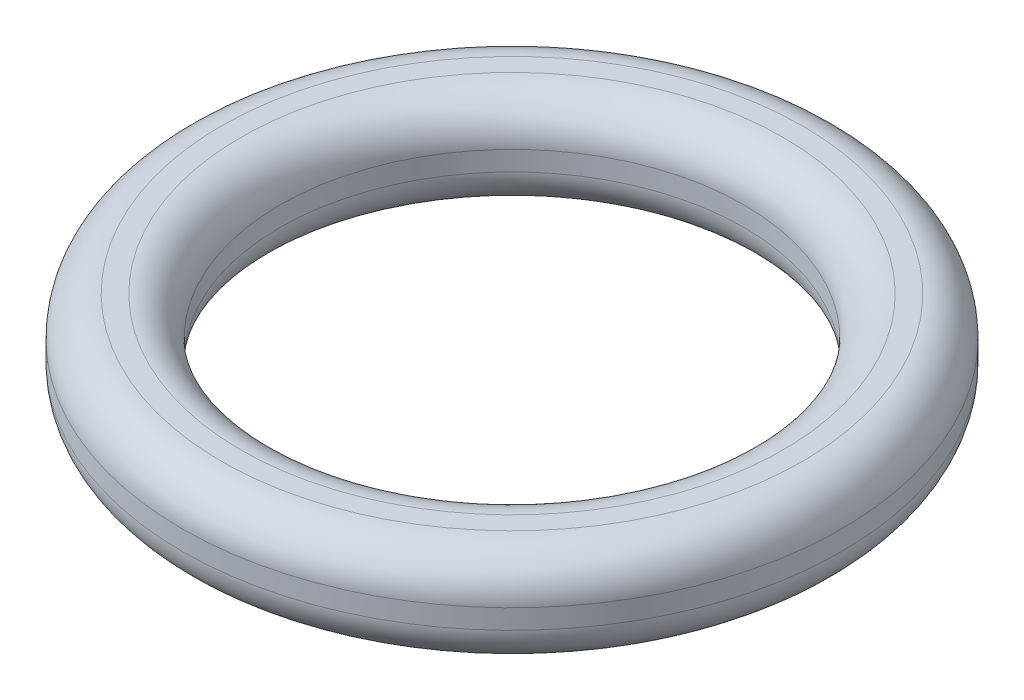
ISO-10303-21;
HEADER;
FILE_DESCRIPTION(('STEP AP214'),'2;1');
FILE_NAME('part.step','',(''),(''),'','','');
FILE_SCHEMA(('AUTOMOTIVE_DESIGN { 1 0 10303 214 1 1 1 1 }'));
ENDSEC;
DATA;
#1=APPLICATION_CONTEXT('core data for automotive mechanical design processes');
#2=APPLICATION_PROTOCOL_DEFINITION('international standard','automotive_design',2000,#1);
#3=PRODUCT_CONTEXT('',#1,'mechanical');
#4=PRODUCT('Part','Part','',(#3));
#5=PRODUCT_RELATED_PRODUCT_CATEGORY('part','',(#4));
#6=PRODUCT_DEFINITION_FORMATION('','',#4);
#7=PRODUCT_DEFINITION_CONTEXT('part definition',#1,'design');
#8=PRODUCT_DEFINITION('design','',#6,#7);
#9=PRODUCT_DEFINITION_SHAPE('','',#8);
#10=(LENGTH_UNIT() NAMED_UNIT(*) SI_UNIT(.MILLI.,.METRE.));
#11=(NAMED_UNIT(*) PLANE_ANGLE_UNIT() SI_UNIT($,.RADIAN.));
#12=(NAMED_UNIT(*) SI_UNIT($,.STERADIAN.) SOLID_ANGLE_UNIT());
#13=UNCERTAINTY_MEASURE_WITH_UNIT(LENGTH_MEASURE(1.E-05),#10,'distance_accuracy_value','');
#14=(GEOMETRIC_REPRESENTATION_CONTEXT(3) GLOBAL_UNCERTAINTY_ASSIGNED_CONTEXT((#13)) GLOBAL_UNIT_ASSIGNED_CONTEXT((#10,
#11,#12)) REPRESENTATION_CONTEXT('',''));
#15=CARTESIAN_POINT('',(0.,0.,0.));
#16=DIRECTION('',(0.,0.,1.));
#17=DIRECTION('',(1.,0.,0.));
#18=AXIS2_PLACEMENT_3D('',#15,#16,#17);
#19=CARTESIAN_POINT('',(0.,0.8,0.));
#20=DIRECTION('',(0.,-1.,0.));
#21=DIRECTION('',(0.,0.,-1.));
#22=AXIS2_PLACEMENT_3D('',#19,#20,#21);
#23=TOROIDAL_SURFACE('',#22,5.95,0.8);
#24=CARTESIAN_POINT('',(0.,0.,0.));
#25=DIRECTION('',(0.,-1.,0.));
#26=DIRECTION('',(0.,0.,-1.));
#27=AXIS2_PLACEMENT_3D('',#24,#25,#26);
#28=CIRCLE('',#27,5.95);
#29=CARTESIAN_POINT('',(0.,0.,-5.95));
#30=VERTEX_POINT('',#29);
#31=EDGE_CURVE('E10',#30,#30,#28,.T.);
#32=ORIENTED_EDGE('',*,*,#31,.F.);
#33=EDGE_LOOP('',(#32));
#34=FACE_BOUND('',#33,.T.);
#35=CARTESIAN_POINT('',(0.,0.8,0.));
#36=DIRECTION('',(0.,-1.,0.));
#37=DIRECTION('',(0.,0.,-1.));
#38=AXIS2_PLACEMENT_3D('',#35,#36,#37);
#39=CIRCLE('',#38,6.75);
#40=CARTESIAN_POINT('',(0.,0.8,-6.75));
#41=VERTEX_POINT('',#40);
#42=EDGE_CURVE('E56',#41,#41,#39,.T.);
#43=ORIENTED_EDGE('',*,*,#42,.T.);
#44=EDGE_LOOP('',(#43));
#45=FACE_BOUND('',#44,.T.);
#46=ADVANCED_FACE('F28',(#34,#45),#23,.T.);
#47=CARTESIAN_POINT('',(-5.95,0.,0.));
#48=DIRECTION('',(0.,1.,0.));
#49=DIRECTION('',(0.,0.,1.));
#50=AXIS2_PLACEMENT_3D('',#47,#48,#49);
#51=PLANE('',#50);
#52=CARTESIAN_POINT('',(0.,0.,0.));
#53=DIRECTION('',(0.,-1.,0.));
#54=DIRECTION('',(0.,0.,-1.));
#55=AXIS2_PLACEMENT_3D('',#52,#53,#54);
#56=CIRCLE('',#55,5.55);
#57=CARTESIAN_POINT('',(0.,0.,-5.55));
#58=VERTEX_POINT('',#57);
#59=EDGE_CURVE('E34',#58,#58,#56,.T.);
#60=ORIENTED_EDGE('',*,*,#59,.F.);
#61=EDGE_LOOP('',(#60));
#62=FACE_BOUND('',#61,.T.);
#63=ORIENTED_EDGE('',*,*,#31,.T.);
#64=EDGE_LOOP('',(#63));
#65=FACE_BOUND('',#64,.T.);
#66=ADVANCED_FACE('F93',(#62,#65),#51,.F.);
#67=CARTESIAN_POINT('',(0.,0.8,0.));
#68=DIRECTION('',(0.,-1.,0.));
#69=DIRECTION('',(0.,0.,-1.));
#70=AXIS2_PLACEMENT_3D('',#67,#68,#69);
#71=TOROIDAL_SURFACE('',#70,5.55,0.8);
#72=CARTESIAN_POINT('',(0.,0.8,0.));
#73=DIRECTION('',(0.,-1.,0.));
#74=DIRECTION('',(0.,0.,-1.));
#75=AXIS2_PLACEMENT_3D('',#72,#73,#74);
#76=CIRCLE('',#75,4.75);
#77=CARTESIAN_POINT('',(0.,0.8,-4.75));
#78=VERTEX_POINT('',#77);
#79=EDGE_CURVE('E38',#78,#78,#76,.T.);
#80=ORIENTED_EDGE('',*,*,#79,.F.);
#81=EDGE_LOOP('',(#80));
#82=FACE_BOUND('',#81,.T.);
#83=ORIENTED_EDGE('',*,*,#59,.T.);
#84=EDGE_LOOP('',(#83));
#85=FACE_BOUND('',#84,.T.);
#86=ADVANCED_FACE('F88',(#82,#85),#71,.T.);
#87=CARTESIAN_POINT('',(0.,0.,0.));
#88=DIRECTION('',(0.,-1.,0.));
#89=DIRECTION('',(0.,0.,-1.));
#90=AXIS2_PLACEMENT_3D('',#87,#88,#89);
#91=CYLINDRICAL_SURFACE('',#90,4.75);
#92=CARTESIAN_POINT('',(0.,1.2,0.));
#93=DIRECTION('',(0.,-1.,0.));
#94=DIRECTION('',(0.,0.,-1.));
#95=AXIS2_PLACEMENT_3D('',#92,#93,#94);
#96=CIRCLE('',#95,4.75);
#97=CARTESIAN_POINT('',(0.,1.2,-4.75));
#98=VERTEX_POINT('',#97);
#99=EDGE_CURVE('E42',#98,#98,#96,.T.);
#100=ORIENTED_EDGE('',*,*,#99,.F.);
#101=EDGE_LOOP('',(#100));
#102=FACE_BOUND('',#101,.T.);
#103=ORIENTED_EDGE('',*,*,#79,.T.);
#104=EDGE_LOOP('',(#103));
#105=FACE_BOUND('',#104,.T.);
#106=ADVANCED_FACE('F82',(#102,#105),#91,.F.);
#107=CARTESIAN_POINT('',(0.,1.2,0.));
#108=DIRECTION('',(0.,-1.,0.));
#109=DIRECTION('',(0.,0.,-1.));
#110=AXIS2_PLACEMENT_3D('',#107,#108,#109);
#111=TOROIDAL_SURFACE('',#110,5.55,0.800000000000001);
#112=CARTESIAN_POINT('',(0.,2.,0.));
#113=DIRECTION('',(0.,-1.,0.));
#114=DIRECTION('',(0.,0.,-1.));
#115=AXIS2_PLACEMENT_3D('',#112,#113,#114);
#116=CIRCLE('',#115,5.55);
#117=CARTESIAN_POINT('',(0.,2.,-5.55));
#118=VERTEX_POINT('',#117);
#119=EDGE_CURVE('E47',#118,#118,#116,.T.);
#120=ORIENTED_EDGE('',*,*,#119,.F.);
#121=EDGE_LOOP('',(#120));
#122=FACE_BOUND('',#121,.T.);
#123=ORIENTED_EDGE('',*,*,#99,.T.);
#124=EDGE_LOOP('',(#123));
#125=FACE_BOUND('',#124,.T.);
#126=ADVANCED_FACE('F76',(#122,#125),#111,.T.);
#127=CARTESIAN_POINT('',(-5.95,2.,0.));
#128=DIRECTION('',(0.,-1.,0.));
#129=DIRECTION('',(0.,0.,-1.));
#130=AXIS2_PLACEMENT_3D('',#127,#128,#129);
#131=PLANE('',#130);
#132=CARTESIAN_POINT('',(0.,2.,0.));
#133=DIRECTION('',(0.,-1.,0.));
#134=DIRECTION('',(0.,0.,-1.));
#135=AXIS2_PLACEMENT_3D('',#132,#133,#134);
#136=CIRCLE('',#135,5.95);
#137=CARTESIAN_POINT('',(0.,2.,-5.95));
#138=VERTEX_POINT('',#137);
#139=EDGE_CURVE('E50',#138,#138,#136,.T.);
#140=ORIENTED_EDGE('',*,*,#139,.F.);
#141=EDGE_LOOP('',(#140));
#142=FACE_BOUND('',#141,.T.);
#143=ORIENTED_EDGE('',*,*,#119,.T.);
#144=EDGE_LOOP('',(#143));
#145=FACE_BOUND('',#144,.T.);
#146=ADVANCED_FACE('F70',(#142,#145),#131,.F.);
#147=CARTESIAN_POINT('',(0.,1.2,0.));
#148=DIRECTION('',(0.,-1.,0.));
#149=DIRECTION('',(0.,0.,-1.));
#150=AXIS2_PLACEMENT_3D('',#147,#148,#149);
#151=TOROIDAL_SURFACE('',#150,5.95,0.8);
#152=CARTESIAN_POINT('',(0.,1.2,0.));
#153=DIRECTION('',(0.,-1.,0.));
#154=DIRECTION('',(0.,0.,-1.));
#155=AXIS2_PLACEMENT_3D('',#152,#153,#154);
#156=CIRCLE('',#155,6.75);
#157=CARTESIAN_POINT('',(0.,1.2,-6.75));
#158=VERTEX_POINT('',#157);
#159=EDGE_CURVE('E53',#158,#158,#156,.T.);
#160=ORIENTED_EDGE('',*,*,#159,.F.);
#161=EDGE_LOOP('',(#160));
#162=FACE_BOUND('',#161,.T.);
#163=ORIENTED_EDGE('',*,*,#139,.T.);
#164=EDGE_LOOP('',(#163));
#165=FACE_BOUND('',#164,.T.);
#166=ADVANCED_FACE('F64',(#162,#165),#151,.T.);
#167=CARTESIAN_POINT('',(0.,0.,0.));
#168=DIRECTION('',(0.,-1.,0.));
#169=DIRECTION('',(0.,0.,-1.));
#170=AXIS2_PLACEMENT_3D('',#167,#168,#169);
#171=CYLINDRICAL_SURFACE('',#170,6.75);
#172=ORIENTED_EDGE('',*,*,#42,.F.);
#173=EDGE_LOOP('',(#172));
#174=FACE_BOUND('',#173,.T.);
#175=ORIENTED_EDGE('',*,*,#159,.T.);
#176=EDGE_LOOP('',(#175));
#177=FACE_BOUND('',#176,.T.);
#178=ADVANCED_FACE('F61',(#174,#177),#171,.T.);
#179=CLOSED_SHELL('',(#46,#66,#86,#106,#126,#146,#166,#178));
#180=MANIFOLD_SOLID_BREP('B2',#179);
#181=ADVANCED_BREP_SHAPE_REPRESENTATION('',(#18,#180),#14);
#182=SHAPE_DEFINITION_REPRESENTATION(#9,#181);
ENDSEC;
END-ISO-10303-21;
